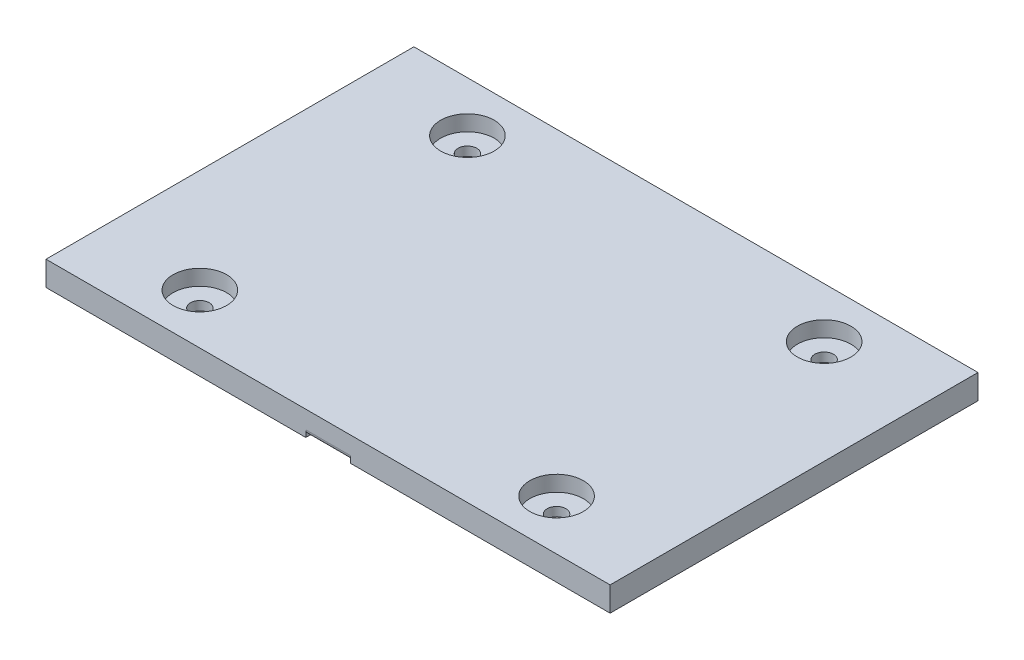
ISO-10303-21;
HEADER;
FILE_DESCRIPTION(('STEP AP214'),'2;1');
FILE_NAME('part.step','',(''),(''),'','','');
FILE_SCHEMA(('AUTOMOTIVE_DESIGN { 1 0 10303 214 1 1 1 1 }'));
ENDSEC;
DATA;
#1=APPLICATION_CONTEXT('core data for automotive mechanical design processes');
#2=APPLICATION_PROTOCOL_DEFINITION('international standard','automotive_design',2000,#1);
#3=PRODUCT_CONTEXT('',#1,'mechanical');
#4=PRODUCT('Part','Part','',(#3));
#5=PRODUCT_RELATED_PRODUCT_CATEGORY('part','',(#4));
#6=PRODUCT_DEFINITION_FORMATION('','',#4);
#7=PRODUCT_DEFINITION_CONTEXT('part definition',#1,'design');
#8=PRODUCT_DEFINITION('design','',#6,#7);
#9=PRODUCT_DEFINITION_SHAPE('','',#8);
#10=(LENGTH_UNIT() NAMED_UNIT(*) SI_UNIT(.MILLI.,.METRE.));
#11=(NAMED_UNIT(*) PLANE_ANGLE_UNIT() SI_UNIT($,.RADIAN.));
#12=(NAMED_UNIT(*) SI_UNIT($,.STERADIAN.) SOLID_ANGLE_UNIT());
#13=UNCERTAINTY_MEASURE_WITH_UNIT(LENGTH_MEASURE(1.E-05),#10,'distance_accuracy_value','');
#14=(GEOMETRIC_REPRESENTATION_CONTEXT(3) GLOBAL_UNCERTAINTY_ASSIGNED_CONTEXT((#13)) GLOBAL_UNIT_ASSIGNED_CONTEXT((#10,
#11,#12)) REPRESENTATION_CONTEXT('',''));
#15=CARTESIAN_POINT('',(0.,0.,0.));
#16=DIRECTION('',(0.,0.,1.));
#17=DIRECTION('',(1.,0.,0.));
#18=AXIS2_PLACEMENT_3D('',#15,#16,#17);
#19=CARTESIAN_POINT('',(0.,60.645974268059,0.));
#20=DIRECTION('',(0.,-1.,0.));
#21=DIRECTION('',(0.,0.,-1.));
#22=AXIS2_PLACEMENT_3D('',#19,#20,#21);
#23=PLANE('',#22);
#24=CARTESIAN_POINT('',(24.8089806938948,60.645974268059,119.523129836377));
#25=DIRECTION('',(0.,-1.,0.));
#26=DIRECTION('',(0.,0.,-1.));
#27=AXIS2_PLACEMENT_3D('',#24,#25,#26);
#28=CIRCLE('',#27,2.09999999999998);
#29=CARTESIAN_POINT('',(24.8089806938948,60.645974268059,117.423129836377));
#30=VERTEX_POINT('',#29);
#31=EDGE_CURVE('E389',#30,#30,#28,.T.);
#32=ORIENTED_EDGE('',*,*,#31,.T.);
#33=EDGE_LOOP('',(#32));
#34=FACE_BOUND('',#33,.T.);
#35=CARTESIAN_POINT('',(24.8089806938948,60.645974268059,119.523129836377));
#36=DIRECTION('',(0.,-1.,0.));
#37=DIRECTION('',(0.,0.,-1.));
#38=AXIS2_PLACEMENT_3D('',#35,#36,#37);
#39=CIRCLE('',#38,6.);
#40=CARTESIAN_POINT('',(24.8089806938948,60.645974268059,113.523129836377));
#41=VERTEX_POINT('',#40);
#42=EDGE_CURVE('E11',#41,#41,#39,.T.);
#43=ORIENTED_EDGE('',*,*,#42,.F.);
#44=EDGE_LOOP('',(#43));
#45=FACE_BOUND('',#44,.T.);
#46=ADVANCED_FACE('F32',(#34,#45),#23,.F.);
#47=CARTESIAN_POINT('',(104.808980693895,60.645974268059,119.523129836377));
#48=DIRECTION('',(0.,-1.,0.));
#49=DIRECTION('',(0.,0.,-1.));
#50=AXIS2_PLACEMENT_3D('',#47,#48,#49);
#51=CIRCLE('',#50,2.1);
#52=CARTESIAN_POINT('',(104.808980693895,60.645974268059,117.423129836377));
#53=VERTEX_POINT('',#52);
#54=EDGE_CURVE('E349',#53,#53,#51,.T.);
#55=ORIENTED_EDGE('',*,*,#54,.T.);
#56=EDGE_LOOP('',(#55));
#57=FACE_BOUND('',#56,.T.);
#58=CARTESIAN_POINT('',(104.808980693895,60.645974268059,119.523129836377));
#59=DIRECTION('',(0.,-1.,0.));
#60=DIRECTION('',(0.,0.,-1.));
#61=AXIS2_PLACEMENT_3D('',#58,#59,#60);
#62=CIRCLE('',#61,6.);
#63=CARTESIAN_POINT('',(104.808980693895,60.645974268059,113.523129836377));
#64=VERTEX_POINT('',#63);
#65=EDGE_CURVE('E41',#64,#64,#62,.T.);
#66=ORIENTED_EDGE('',*,*,#65,.F.);
#67=EDGE_LOOP('',(#66));
#68=FACE_BOUND('',#67,.T.);
#69=ADVANCED_FACE('F472',(#57,#68),#23,.F.);
#70=CARTESIAN_POINT('',(104.808980693895,60.645974268059,59.5231298363773));
#71=DIRECTION('',(0.,-1.,0.));
#72=DIRECTION('',(0.,0.,-1.));
#73=AXIS2_PLACEMENT_3D('',#70,#71,#72);
#74=CIRCLE('',#73,2.1);
#75=CARTESIAN_POINT('',(104.808980693895,60.645974268059,57.4231298363772));
#76=VERTEX_POINT('',#75);
#77=EDGE_CURVE('E395',#76,#76,#74,.T.);
#78=ORIENTED_EDGE('',*,*,#77,.T.);
#79=EDGE_LOOP('',(#78));
#80=FACE_BOUND('',#79,.T.);
#81=CARTESIAN_POINT('',(104.808980693895,60.645974268059,59.5231298363773));
#82=DIRECTION('',(0.,-1.,0.));
#83=DIRECTION('',(0.,0.,-1.));
#84=AXIS2_PLACEMENT_3D('',#81,#82,#83);
#85=CIRCLE('',#84,6.);
#86=CARTESIAN_POINT('',(104.808980693895,60.645974268059,53.5231298363773));
#87=VERTEX_POINT('',#86);
#88=EDGE_CURVE('E443',#87,#87,#85,.T.);
#89=ORIENTED_EDGE('',*,*,#88,.F.);
#90=EDGE_LOOP('',(#89));
#91=FACE_BOUND('',#90,.T.);
#92=ADVANCED_FACE('F479',(#80,#91),#23,.F.);
#93=CARTESIAN_POINT('',(24.8089806938948,60.645974268059,59.5231298363773));
#94=DIRECTION('',(0.,-1.,0.));
#95=DIRECTION('',(0.,0.,-1.));
#96=AXIS2_PLACEMENT_3D('',#93,#94,#95);
#97=CIRCLE('',#96,2.1);
#98=CARTESIAN_POINT('',(24.8089806938948,60.645974268059,57.4231298363773));
#99=VERTEX_POINT('',#98);
#100=EDGE_CURVE('E401',#99,#99,#97,.T.);
#101=ORIENTED_EDGE('',*,*,#100,.T.);
#102=EDGE_LOOP('',(#101));
#103=FACE_BOUND('',#102,.T.);
#104=CARTESIAN_POINT('',(24.8089806938948,60.645974268059,59.5231298363773));
#105=DIRECTION('',(0.,-1.,0.));
#106=DIRECTION('',(0.,0.,-1.));
#107=AXIS2_PLACEMENT_3D('',#104,#105,#106);
#108=CIRCLE('',#107,6.);
#109=CARTESIAN_POINT('',(24.8089806938948,60.645974268059,53.5231298363773));
#110=VERTEX_POINT('',#109);
#111=EDGE_CURVE('E241',#110,#110,#108,.T.);
#112=ORIENTED_EDGE('',*,*,#111,.F.);
#113=EDGE_LOOP('',(#112));
#114=FACE_BOUND('',#113,.T.);
#115=ADVANCED_FACE('F475',(#103,#114),#23,.F.);
#116=CARTESIAN_POINT('',(0.,58.6459742680589,0.));
#117=DIRECTION('',(0.,-1.,0.));
#118=DIRECTION('',(0.,0.,-1.));
#119=AXIS2_PLACEMENT_3D('',#116,#117,#118);
#120=PLANE('',#119);
#121=DIRECTION('',(0.,0.,1.));
#122=VECTOR('',#121,1.);
#123=CARTESIAN_POINT('',(69.8089806938948,58.6459742680589,0.));
#124=LINE('',#123,#122);
#125=CARTESIAN_POINT('',(69.8089806938948,58.6459742680589,121.523129836377));
#126=VERTEX_POINT('',#125);
#127=CARTESIAN_POINT('',(69.8089806938948,58.6459742680589,130.773129836377));
#128=VERTEX_POINT('',#127);
#129=EDGE_CURVE('E324',#126,#128,#124,.T.);
#130=ORIENTED_EDGE('',*,*,#129,.F.);
#131=DIRECTION('',(1.,0.,0.));
#132=VECTOR('',#131,1.);
#133=CARTESIAN_POINT('',(0.,58.6459742680589,121.523129836377));
#134=LINE('',#133,#132);
#135=CARTESIAN_POINT('',(96.8089806938948,58.6459742680589,121.523129836377));
#136=VERTEX_POINT('',#135);
#137=EDGE_CURVE('E321',#126,#136,#134,.T.);
#138=ORIENTED_EDGE('',*,*,#137,.T.);
#139=DIRECTION('',(0.,0.,-1.));
#140=VECTOR('',#139,1.);
#141=CARTESIAN_POINT('',(96.8089806938948,58.6459742680589,0.));
#142=LINE('',#141,#140);
#143=CARTESIAN_POINT('',(96.8089806938948,58.6459742680589,94.5231298363772));
#144=VERTEX_POINT('',#143);
#145=EDGE_CURVE('E318',#136,#144,#142,.T.);
#146=ORIENTED_EDGE('',*,*,#145,.T.);
#147=DIRECTION('',(-1.,0.,0.));
#148=VECTOR('',#147,1.);
#149=CARTESIAN_POINT('',(0.,58.6459742680589,94.5231298363772));
#150=LINE('',#149,#148);
#151=CARTESIAN_POINT('',(116.808980693895,58.6459742680589,94.5231298363772));
#152=VERTEX_POINT('',#151);
#153=EDGE_CURVE('E315',#152,#144,#150,.T.);
#154=ORIENTED_EDGE('',*,*,#153,.F.);
#155=DIRECTION('',(0.,0.,1.));
#156=VECTOR('',#155,1.);
#157=CARTESIAN_POINT('',(116.808980693895,58.6459742680589,0.));
#158=LINE('',#157,#156);
#159=CARTESIAN_POINT('',(116.808980693895,58.6459742680589,84.5231298363773));
#160=VERTEX_POINT('',#159);
#161=EDGE_CURVE('E312',#160,#152,#158,.T.);
#162=ORIENTED_EDGE('',*,*,#161,.F.);
#163=DIRECTION('',(1.,0.,0.));
#164=VECTOR('',#163,1.);
#165=CARTESIAN_POINT('',(0.,58.6459742680589,84.5231298363773));
#166=LINE('',#165,#164);
#167=CARTESIAN_POINT('',(96.8089806938948,58.6459742680589,84.5231298363773));
#168=VERTEX_POINT('',#167);
#169=EDGE_CURVE('E309',#168,#160,#166,.T.);
#170=ORIENTED_EDGE('',*,*,#169,.F.);
#171=DIRECTION('',(0.,0.,-1.));
#172=VECTOR('',#171,1.);
#173=CARTESIAN_POINT('',(96.8089806938948,58.6459742680589,0.));
#174=LINE('',#173,#172);
#175=CARTESIAN_POINT('',(96.8089806938948,58.6459742680589,57.5231298363773));
#176=VERTEX_POINT('',#175);
#177=EDGE_CURVE('E306',#168,#176,#174,.T.);
#178=ORIENTED_EDGE('',*,*,#177,.T.);
#179=DIRECTION('',(-1.,0.,0.));
#180=VECTOR('',#179,1.);
#181=CARTESIAN_POINT('',(0.,58.6459742680589,57.5231298363773));
#182=LINE('',#181,#180);
#183=CARTESIAN_POINT('',(69.8089806938948,58.6459742680589,57.5231298363773));
#184=VERTEX_POINT('',#183);
#185=EDGE_CURVE('E303',#176,#184,#182,.T.);
#186=ORIENTED_EDGE('',*,*,#185,.T.);
#187=DIRECTION('',(0.,0.,-1.));
#188=VECTOR('',#187,1.);
#189=CARTESIAN_POINT('',(69.8089806938948,58.6459742680589,0.));
#190=LINE('',#189,#188);
#191=CARTESIAN_POINT('',(69.8089806938948,58.6459742680589,48.2731298363773));
#192=VERTEX_POINT('',#191);
#193=EDGE_CURVE('E300',#184,#192,#190,.T.);
#194=ORIENTED_EDGE('',*,*,#193,.T.);
#195=DIRECTION('',(1.,0.,0.));
#196=VECTOR('',#195,1.);
#197=CARTESIAN_POINT('',(1.55898069389482,58.6459742680589,48.2731298363773));
#198=LINE('',#197,#196);
#199=CARTESIAN_POINT('',(128.058980693895,58.6459742680589,48.2731298363773));
#200=VERTEX_POINT('',#199);
#201=EDGE_CURVE('E407',#192,#200,#198,.T.);
#202=ORIENTED_EDGE('',*,*,#201,.T.);
#203=DIRECTION('',(0.,0.,1.));
#204=VECTOR('',#203,1.);
#205=CARTESIAN_POINT('',(128.058980693895,58.6459742680589,48.2731298363773));
#206=LINE('',#205,#204);
#207=CARTESIAN_POINT('',(128.058980693895,58.6459742680589,130.773129836377));
#208=VERTEX_POINT('',#207);
#209=EDGE_CURVE('E213',#200,#208,#206,.T.);
#210=ORIENTED_EDGE('',*,*,#209,.T.);
#211=DIRECTION('',(-1.,0.,0.));
#212=VECTOR('',#211,1.);
#213=CARTESIAN_POINT('',(128.058980693895,58.6459742680589,130.773129836377));
#214=LINE('',#213,#212);
#215=EDGE_CURVE('E415',#208,#128,#214,.T.);
#216=ORIENTED_EDGE('',*,*,#215,.T.);
#217=EDGE_LOOP('',(#130,#138,#146,#154,#162,#170,#178,#186,#194,#202,#210,#216));
#218=FACE_BOUND('',#217,.T.);
#219=CARTESIAN_POINT('',(104.808980693895,58.6459742680589,119.523129836377));
#220=DIRECTION('',(0.,-1.,0.));
#221=DIRECTION('',(0.,0.,-1.));
#222=AXIS2_PLACEMENT_3D('',#219,#220,#221);
#223=CIRCLE('',#222,2.1);
#224=CARTESIAN_POINT('',(104.808980693895,58.6459742680589,117.423129836377));
#225=VERTEX_POINT('',#224);
#226=EDGE_CURVE('E386',#225,#225,#223,.T.);
#227=ORIENTED_EDGE('',*,*,#226,.F.);
#228=EDGE_LOOP('',(#227));
#229=FACE_BOUND('',#228,.T.);
#230=CARTESIAN_POINT('',(104.808980693895,58.6459742680589,59.5231298363773));
#231=DIRECTION('',(0.,-1.,0.));
#232=DIRECTION('',(0.,0.,-1.));
#233=AXIS2_PLACEMENT_3D('',#230,#231,#232);
#234=CIRCLE('',#233,2.1);
#235=CARTESIAN_POINT('',(104.808980693895,58.6459742680589,57.4231298363772));
#236=VERTEX_POINT('',#235);
#237=EDGE_CURVE('E398',#236,#236,#234,.T.);
#238=ORIENTED_EDGE('',*,*,#237,.F.);
#239=EDGE_LOOP('',(#238));
#240=FACE_BOUND('',#239,.T.);
#241=ADVANCED_FACE('F484',(#218,#229,#240),#120,.T.);
#242=CARTESIAN_POINT('',(1.55898069389482,58.6459742680589,48.2731298363773));
#243=DIRECTION('',(0.,0.,1.));
#244=DIRECTION('',(1.,0.,0.));
#245=AXIS2_PLACEMENT_3D('',#242,#243,#244);
#246=PLANE('',#245);
#247=DIRECTION('',(-1.,0.,0.));
#248=VECTOR('',#247,1.);
#249=CARTESIAN_POINT('',(59.8089806938948,60.145974268059,48.2731298363773));
#250=LINE('',#249,#248);
#251=CARTESIAN_POINT('',(69.8089806938948,60.145974268059,48.2731298363773));
#252=VERTEX_POINT('',#251);
#253=CARTESIAN_POINT('',(59.8089806938948,60.145974268059,48.2731298363773));
#254=VERTEX_POINT('',#253);
#255=EDGE_CURVE('E217',#252,#254,#250,.T.);
#256=ORIENTED_EDGE('',*,*,#255,.T.);
#257=DIRECTION('',(0.,-1.,0.));
#258=VECTOR('',#257,1.);
#259=CARTESIAN_POINT('',(59.8089806938948,59.145974268059,48.2731298363773));
#260=LINE('',#259,#258);
#261=CARTESIAN_POINT('',(59.8089806938948,58.6459742680589,48.2731298363773));
#262=VERTEX_POINT('',#261);
#263=EDGE_CURVE('E382',#254,#262,#260,.T.);
#264=ORIENTED_EDGE('',*,*,#263,.T.);
#265=CARTESIAN_POINT('',(1.55898069389482,58.6459742680589,48.2731298363773));
#266=VERTEX_POINT('',#265);
#267=EDGE_CURVE('E410',#266,#262,#198,.T.);
#268=ORIENTED_EDGE('',*,*,#267,.F.);
#269=DIRECTION('',(0.,1.,0.));
#270=VECTOR('',#269,1.);
#271=CARTESIAN_POINT('',(1.55898069389482,58.6459742680589,48.2731298363773));
#272=LINE('',#271,#270);
#273=CARTESIAN_POINT('',(1.55898069389482,64.145974268059,48.2731298363773));
#274=VERTEX_POINT('',#273);
#275=EDGE_CURVE('E234',#266,#274,#272,.T.);
#276=ORIENTED_EDGE('',*,*,#275,.T.);
#277=DIRECTION('',(1.,0.,0.));
#278=VECTOR('',#277,1.);
#279=CARTESIAN_POINT('',(128.058980693895,64.145974268059,48.2731298363773));
#280=LINE('',#279,#278);
#281=CARTESIAN_POINT('',(128.058980693895,64.145974268059,48.2731298363773));
#282=VERTEX_POINT('',#281);
#283=EDGE_CURVE('E225',#274,#282,#280,.T.);
#284=ORIENTED_EDGE('',*,*,#283,.T.);
#285=DIRECTION('',(0.,1.,0.));
#286=VECTOR('',#285,1.);
#287=CARTESIAN_POINT('',(128.058980693895,58.6459742680589,48.2731298363773));
#288=LINE('',#287,#286);
#289=EDGE_CURVE('E208',#200,#282,#288,.T.);
#290=ORIENTED_EDGE('',*,*,#289,.F.);
#291=ORIENTED_EDGE('',*,*,#201,.F.);
#292=DIRECTION('',(0.,-1.,0.));
#293=VECTOR('',#292,1.);
#294=CARTESIAN_POINT('',(69.8089806938948,59.145974268059,48.2731298363773));
#295=LINE('',#294,#293);
#296=EDGE_CURVE('E380',#252,#192,#295,.T.);
#297=ORIENTED_EDGE('',*,*,#296,.F.);
#298=EDGE_LOOP('',(#256,#264,#268,#276,#284,#290,#291,#297));
#299=FACE_BOUND('',#298,.T.);
#300=ADVANCED_FACE('F231',(#299),#246,.F.);
#301=DIRECTION('',(0.,0.,-1.));
#302=VECTOR('',#301,1.);
#303=CARTESIAN_POINT('',(59.8089806938948,58.6459742680589,0.));
#304=LINE('',#303,#302);
#305=CARTESIAN_POINT('',(59.8089806938948,58.6459742680589,130.773129836377));
#306=VERTEX_POINT('',#305);
#307=CARTESIAN_POINT('',(59.8089806938948,58.6459742680589,121.523129836377));
#308=VERTEX_POINT('',#307);
#309=EDGE_CURVE('E326',#306,#308,#304,.T.);
#310=ORIENTED_EDGE('',*,*,#309,.F.);
#311=CARTESIAN_POINT('',(1.55898069389482,58.6459742680589,130.773129836377));
#312=VERTEX_POINT('',#311);
#313=EDGE_CURVE('E414',#306,#312,#214,.T.);
#314=ORIENTED_EDGE('',*,*,#313,.T.);
#315=DIRECTION('',(0.,0.,-1.));
#316=VECTOR('',#315,1.);
#317=CARTESIAN_POINT('',(1.55898069389482,58.6459742680589,130.773129836377));
#318=LINE('',#317,#316);
#319=EDGE_CURVE('E418',#312,#266,#318,.T.);
#320=ORIENTED_EDGE('',*,*,#319,.T.);
#321=ORIENTED_EDGE('',*,*,#267,.T.);
#322=DIRECTION('',(0.,0.,-1.));
#323=VECTOR('',#322,1.);
#324=CARTESIAN_POINT('',(59.8089806938948,58.6459742680589,0.));
#325=LINE('',#324,#323);
#326=CARTESIAN_POINT('',(59.8089806938948,58.6459742680589,57.5231298363773));
#327=VERTEX_POINT('',#326);
#328=EDGE_CURVE('E298',#327,#262,#325,.T.);
#329=ORIENTED_EDGE('',*,*,#328,.F.);
#330=DIRECTION('',(-1.,0.,0.));
#331=VECTOR('',#330,1.);
#332=CARTESIAN_POINT('',(0.,58.6459742680589,57.5231298363773));
#333=LINE('',#332,#331);
#334=CARTESIAN_POINT('',(32.8089806938948,58.6459742680589,57.5231298363773));
#335=VERTEX_POINT('',#334);
#336=EDGE_CURVE('E246',#327,#335,#333,.T.);
#337=ORIENTED_EDGE('',*,*,#336,.T.);
#338=DIRECTION('',(0.,0.,1.));
#339=VECTOR('',#338,1.);
#340=CARTESIAN_POINT('',(32.8089806938948,58.6459742680589,0.));
#341=LINE('',#340,#339);
#342=CARTESIAN_POINT('',(32.8089806938948,58.6459742680589,84.5231298363773));
#343=VERTEX_POINT('',#342);
#344=EDGE_CURVE('E251',#335,#343,#341,.T.);
#345=ORIENTED_EDGE('',*,*,#344,.T.);
#346=DIRECTION('',(1.,0.,0.));
#347=VECTOR('',#346,1.);
#348=CARTESIAN_POINT('',(0.,58.6459742680589,84.5231298363773));
#349=LINE('',#348,#347);
#350=CARTESIAN_POINT('',(12.8089806938948,58.6459742680589,84.5231298363773));
#351=VERTEX_POINT('',#350);
#352=EDGE_CURVE('E341',#351,#343,#349,.T.);
#353=ORIENTED_EDGE('',*,*,#352,.F.);
#354=DIRECTION('',(0.,0.,-1.));
#355=VECTOR('',#354,1.);
#356=CARTESIAN_POINT('',(12.8089806938948,58.6459742680589,0.));
#357=LINE('',#356,#355);
#358=CARTESIAN_POINT('',(12.8089806938948,58.6459742680589,94.5231298363772));
#359=VERTEX_POINT('',#358);
#360=EDGE_CURVE('E338',#359,#351,#357,.T.);
#361=ORIENTED_EDGE('',*,*,#360,.F.);
#362=DIRECTION('',(-1.,0.,0.));
#363=VECTOR('',#362,1.);
#364=CARTESIAN_POINT('',(0.,58.6459742680589,94.5231298363772));
#365=LINE('',#364,#363);
#366=CARTESIAN_POINT('',(32.8089806938948,58.6459742680589,94.5231298363772));
#367=VERTEX_POINT('',#366);
#368=EDGE_CURVE('E335',#367,#359,#365,.T.);
#369=ORIENTED_EDGE('',*,*,#368,.F.);
#370=DIRECTION('',(0.,0.,1.));
#371=VECTOR('',#370,1.);
#372=CARTESIAN_POINT('',(32.8089806938948,58.6459742680589,0.));
#373=LINE('',#372,#371);
#374=CARTESIAN_POINT('',(32.8089806938948,58.6459742680589,121.523129836377));
#375=VERTEX_POINT('',#374);
#376=EDGE_CURVE('E332',#367,#375,#373,.T.);
#377=ORIENTED_EDGE('',*,*,#376,.T.);
#378=DIRECTION('',(1.,0.,0.));
#379=VECTOR('',#378,1.);
#380=CARTESIAN_POINT('',(0.,58.6459742680589,121.523129836377));
#381=LINE('',#380,#379);
#382=EDGE_CURVE('E329',#375,#308,#381,.T.);
#383=ORIENTED_EDGE('',*,*,#382,.T.);
#384=EDGE_LOOP('',(#310,#314,#320,#321,#329,#337,#345,#353,#361,#369,#377,#383));
#385=FACE_BOUND('',#384,.T.);
#386=CARTESIAN_POINT('',(24.8089806938948,58.6459742680589,119.523129836377));
#387=DIRECTION('',(0.,-1.,0.));
#388=DIRECTION('',(0.,0.,-1.));
#389=AXIS2_PLACEMENT_3D('',#386,#387,#388);
#390=CIRCLE('',#389,2.09999999999998);
#391=CARTESIAN_POINT('',(24.8089806938948,58.6459742680589,117.423129836377));
#392=VERTEX_POINT('',#391);
#393=EDGE_CURVE('E392',#392,#392,#390,.T.);
#394=ORIENTED_EDGE('',*,*,#393,.F.);
#395=EDGE_LOOP('',(#394));
#396=FACE_BOUND('',#395,.T.);
#397=CARTESIAN_POINT('',(24.8089806938948,58.6459742680589,59.5231298363773));
#398=DIRECTION('',(0.,-1.,0.));
#399=DIRECTION('',(0.,0.,-1.));
#400=AXIS2_PLACEMENT_3D('',#397,#398,#399);
#401=CIRCLE('',#400,2.1);
#402=CARTESIAN_POINT('',(24.8089806938948,58.6459742680589,57.4231298363773));
#403=VERTEX_POINT('',#402);
#404=EDGE_CURVE('E404',#403,#403,#401,.T.);
#405=ORIENTED_EDGE('',*,*,#404,.F.);
#406=EDGE_LOOP('',(#405));
#407=FACE_BOUND('',#406,.T.);
#408=ADVANCED_FACE('F491',(#385,#396,#407),#120,.T.);
#409=CARTESIAN_POINT('',(128.058980693895,58.6459742680589,48.2731298363773));
#410=DIRECTION('',(-1.,0.,0.));
#411=DIRECTION('',(0.,0.,1.));
#412=AXIS2_PLACEMENT_3D('',#409,#410,#411);
#413=PLANE('',#412);
#414=ORIENTED_EDGE('',*,*,#289,.T.);
#415=DIRECTION('',(0.,0.,1.));
#416=VECTOR('',#415,1.);
#417=CARTESIAN_POINT('',(128.058980693895,64.145974268059,130.773129836377));
#418=LINE('',#417,#416);
#419=CARTESIAN_POINT('',(128.058980693895,64.145974268059,130.773129836377));
#420=VERTEX_POINT('',#419);
#421=EDGE_CURVE('E212',#282,#420,#418,.T.);
#422=ORIENTED_EDGE('',*,*,#421,.T.);
#423=DIRECTION('',(0.,1.,0.));
#424=VECTOR('',#423,1.);
#425=CARTESIAN_POINT('',(128.058980693895,58.6459742680589,130.773129836377));
#426=LINE('',#425,#424);
#427=EDGE_CURVE('E218',#208,#420,#426,.T.);
#428=ORIENTED_EDGE('',*,*,#427,.F.);
#429=ORIENTED_EDGE('',*,*,#209,.F.);
#430=EDGE_LOOP('',(#414,#422,#428,#429));
#431=FACE_BOUND('',#430,.T.);
#432=ADVANCED_FACE('F210',(#431),#413,.F.);
#433=CARTESIAN_POINT('',(128.058980693895,58.6459742680589,130.773129836377));
#434=DIRECTION('',(0.,0.,-1.));
#435=DIRECTION('',(-1.,0.,0.));
#436=AXIS2_PLACEMENT_3D('',#433,#434,#435);
#437=PLANE('',#436);
#438=DIRECTION('',(0.,-1.,0.));
#439=VECTOR('',#438,1.);
#440=CARTESIAN_POINT('',(59.8089806938948,59.145974268059,130.773129836377));
#441=LINE('',#440,#439);
#442=CARTESIAN_POINT('',(59.8089806938948,60.145974268059,130.773129836377));
#443=VERTEX_POINT('',#442);
#444=EDGE_CURVE('E49',#443,#306,#441,.T.);
#445=ORIENTED_EDGE('',*,*,#444,.F.);
#446=DIRECTION('',(-1.,0.,0.));
#447=VECTOR('',#446,1.);
#448=CARTESIAN_POINT('',(69.8089806938948,60.145974268059,130.773129836377));
#449=LINE('',#448,#447);
#450=CARTESIAN_POINT('',(69.8089806938948,60.145974268059,130.773129836377));
#451=VERTEX_POINT('',#450);
#452=EDGE_CURVE('E430',#443,#451,#449,.F.);
#453=ORIENTED_EDGE('',*,*,#452,.T.);
#454=DIRECTION('',(0.,-1.,0.));
#455=VECTOR('',#454,1.);
#456=CARTESIAN_POINT('',(69.8089806938948,59.145974268059,130.773129836377));
#457=LINE('',#456,#455);
#458=EDGE_CURVE('E57',#451,#128,#457,.T.);
#459=ORIENTED_EDGE('',*,*,#458,.T.);
#460=ORIENTED_EDGE('',*,*,#215,.F.);
#461=ORIENTED_EDGE('',*,*,#427,.T.);
#462=DIRECTION('',(-1.,0.,0.));
#463=VECTOR('',#462,1.);
#464=CARTESIAN_POINT('',(1.55898069389482,64.145974268059,130.773129836377));
#465=LINE('',#464,#463);
#466=CARTESIAN_POINT('',(1.55898069389482,64.145974268059,130.773129836377));
#467=VERTEX_POINT('',#466);
#468=EDGE_CURVE('E228',#420,#467,#465,.T.);
#469=ORIENTED_EDGE('',*,*,#468,.T.);
#470=DIRECTION('',(0.,1.,0.));
#471=VECTOR('',#470,1.);
#472=CARTESIAN_POINT('',(1.55898069389482,58.6459742680589,130.773129836377));
#473=LINE('',#472,#471);
#474=EDGE_CURVE('E421',#312,#467,#473,.T.);
#475=ORIENTED_EDGE('',*,*,#474,.F.);
#476=ORIENTED_EDGE('',*,*,#313,.F.);
#477=EDGE_LOOP('',(#445,#453,#459,#460,#461,#469,#475,#476));
#478=FACE_BOUND('',#477,.T.);
#479=ADVANCED_FACE('F509',(#478),#437,.F.);
#480=CARTESIAN_POINT('',(1.55898069389482,58.6459742680589,130.773129836377));
#481=DIRECTION('',(1.,0.,0.));
#482=DIRECTION('',(0.,0.,-1.));
#483=AXIS2_PLACEMENT_3D('',#480,#481,#482);
#484=PLANE('',#483);
#485=ORIENTED_EDGE('',*,*,#474,.T.);
#486=DIRECTION('',(0.,0.,-1.));
#487=VECTOR('',#486,1.);
#488=CARTESIAN_POINT('',(1.55898069389482,64.145974268059,48.2731298363773));
#489=LINE('',#488,#487);
#490=EDGE_CURVE('E244',#467,#274,#489,.T.);
#491=ORIENTED_EDGE('',*,*,#490,.T.);
#492=ORIENTED_EDGE('',*,*,#275,.F.);
#493=ORIENTED_EDGE('',*,*,#319,.F.);
#494=EDGE_LOOP('',(#485,#491,#492,#493));
#495=FACE_BOUND('',#494,.T.);
#496=ADVANCED_FACE('F499',(#495),#484,.F.);
#497=CARTESIAN_POINT('',(24.8089806938948,58.6459742680589,59.5231298363773));
#498=DIRECTION('',(0.,1.,0.));
#499=DIRECTION('',(0.,0.,1.));
#500=AXIS2_PLACEMENT_3D('',#497,#498,#499);
#501=CYLINDRICAL_SURFACE('',#500,2.1);
#502=ORIENTED_EDGE('',*,*,#404,.T.);
#503=EDGE_LOOP('',(#502));
#504=FACE_BOUND('',#503,.T.);
#505=ORIENTED_EDGE('',*,*,#100,.F.);
#506=EDGE_LOOP('',(#505));
#507=FACE_BOUND('',#506,.T.);
#508=ADVANCED_FACE('F496',(#504,#507),#501,.F.);
#509=CARTESIAN_POINT('',(104.808980693895,58.6459742680589,59.5231298363773));
#510=DIRECTION('',(0.,1.,0.));
#511=DIRECTION('',(0.,0.,1.));
#512=AXIS2_PLACEMENT_3D('',#509,#510,#511);
#513=CYLINDRICAL_SURFACE('',#512,2.1);
#514=ORIENTED_EDGE('',*,*,#237,.T.);
#515=EDGE_LOOP('',(#514));
#516=FACE_BOUND('',#515,.T.);
#517=ORIENTED_EDGE('',*,*,#77,.F.);
#518=EDGE_LOOP('',(#517));
#519=FACE_BOUND('',#518,.T.);
#520=ADVANCED_FACE('F498',(#516,#519),#513,.F.);
#521=CARTESIAN_POINT('',(24.8089806938948,58.6459742680589,119.523129836377));
#522=DIRECTION('',(0.,1.,0.));
#523=DIRECTION('',(0.,0.,1.));
#524=AXIS2_PLACEMENT_3D('',#521,#522,#523);
#525=CYLINDRICAL_SURFACE('',#524,2.09999999999998);
#526=ORIENTED_EDGE('',*,*,#393,.T.);
#527=EDGE_LOOP('',(#526));
#528=FACE_BOUND('',#527,.T.);
#529=ORIENTED_EDGE('',*,*,#31,.F.);
#530=EDGE_LOOP('',(#529));
#531=FACE_BOUND('',#530,.T.);
#532=ADVANCED_FACE('F506',(#528,#531),#525,.F.);
#533=CARTESIAN_POINT('',(104.808980693895,58.6459742680589,119.523129836377));
#534=DIRECTION('',(0.,1.,0.));
#535=DIRECTION('',(0.,0.,1.));
#536=AXIS2_PLACEMENT_3D('',#533,#534,#535);
#537=CYLINDRICAL_SURFACE('',#536,2.1);
#538=ORIENTED_EDGE('',*,*,#226,.T.);
#539=EDGE_LOOP('',(#538));
#540=FACE_BOUND('',#539,.T.);
#541=ORIENTED_EDGE('',*,*,#54,.F.);
#542=EDGE_LOOP('',(#541));
#543=FACE_BOUND('',#542,.T.);
#544=ADVANCED_FACE('F528',(#540,#543),#537,.F.);
#545=CARTESIAN_POINT('',(0.,59.145974268059,57.5231298363773));
#546=DIRECTION('',(0.,0.,1.));
#547=DIRECTION('',(1.,0.,0.));
#548=AXIS2_PLACEMENT_3D('',#545,#546,#547);
#549=PLANE('',#548);
#550=ORIENTED_EDGE('',*,*,#336,.F.);
#551=DIRECTION('',(0.,-1.,0.));
#552=VECTOR('',#551,1.);
#553=CARTESIAN_POINT('',(59.8089806938948,59.145974268059,57.5231298363773));
#554=LINE('',#553,#552);
#555=CARTESIAN_POINT('',(59.8089806938948,59.145974268059,57.5231298363773));
#556=VERTEX_POINT('',#555);
#557=EDGE_CURVE('E295',#556,#327,#554,.T.);
#558=ORIENTED_EDGE('',*,*,#557,.F.);
#559=DIRECTION('',(-1.,0.,0.));
#560=VECTOR('',#559,1.);
#561=CARTESIAN_POINT('',(0.,59.145974268059,57.5231298363773));
#562=LINE('',#561,#560);
#563=CARTESIAN_POINT('',(32.8089806938948,59.145974268059,57.5231298363773));
#564=VERTEX_POINT('',#563);
#565=EDGE_CURVE('E247',#556,#564,#562,.T.);
#566=ORIENTED_EDGE('',*,*,#565,.T.);
#567=DIRECTION('',(0.,-1.,0.));
#568=VECTOR('',#567,1.);
#569=CARTESIAN_POINT('',(32.8089806938948,59.145974268059,57.5231298363773));
#570=LINE('',#569,#568);
#571=EDGE_CURVE('E346',#564,#335,#570,.T.);
#572=ORIENTED_EDGE('',*,*,#571,.T.);
#573=EDGE_LOOP('',(#550,#558,#566,#572));
#574=FACE_BOUND('',#573,.T.);
#575=ADVANCED_FACE('F533',(#574),#549,.T.);
#576=CARTESIAN_POINT('',(32.8089806938948,59.145974268059,0.));
#577=DIRECTION('',(1.,0.,0.));
#578=DIRECTION('',(0.,0.,-1.));
#579=AXIS2_PLACEMENT_3D('',#576,#577,#578);
#580=PLANE('',#579);
#581=ORIENTED_EDGE('',*,*,#344,.F.);
#582=ORIENTED_EDGE('',*,*,#571,.F.);
#583=DIRECTION('',(0.,0.,1.));
#584=VECTOR('',#583,1.);
#585=CARTESIAN_POINT('',(32.8089806938948,59.145974268059,0.));
#586=LINE('',#585,#584);
#587=CARTESIAN_POINT('',(32.8089806938948,59.145974268059,84.5231298363773));
#588=VERTEX_POINT('',#587);
#589=EDGE_CURVE('E293',#564,#588,#586,.T.);
#590=ORIENTED_EDGE('',*,*,#589,.T.);
#591=DIRECTION('',(0.,-1.,0.));
#592=VECTOR('',#591,1.);
#593=CARTESIAN_POINT('',(32.8089806938948,59.145974268059,84.5231298363773));
#594=LINE('',#593,#592);
#595=EDGE_CURVE('E350',#588,#343,#594,.T.);
#596=ORIENTED_EDGE('',*,*,#595,.T.);
#597=EDGE_LOOP('',(#581,#582,#590,#596));
#598=FACE_BOUND('',#597,.T.);
#599=ADVANCED_FACE('F539',(#598),#580,.T.);
#600=CARTESIAN_POINT('',(0.,59.145974268059,84.5231298363773));
#601=DIRECTION('',(0.,0.,-1.));
#602=DIRECTION('',(-1.,0.,0.));
#603=AXIS2_PLACEMENT_3D('',#600,#601,#602);
#604=PLANE('',#603);
#605=ORIENTED_EDGE('',*,*,#352,.T.);
#606=ORIENTED_EDGE('',*,*,#595,.F.);
#607=DIRECTION('',(1.,0.,0.));
#608=VECTOR('',#607,1.);
#609=CARTESIAN_POINT('',(0.,59.145974268059,84.5231298363773));
#610=LINE('',#609,#608);
#611=CARTESIAN_POINT('',(12.8089806938948,59.145974268059,84.5231298363773));
#612=VERTEX_POINT('',#611);
#613=EDGE_CURVE('E290',#612,#588,#610,.T.);
#614=ORIENTED_EDGE('',*,*,#613,.F.);
#615=DIRECTION('',(0.,-1.,0.));
#616=VECTOR('',#615,1.);
#617=CARTESIAN_POINT('',(12.8089806938948,59.145974268059,84.5231298363773));
#618=LINE('',#617,#616);
#619=EDGE_CURVE('E352',#612,#351,#618,.T.);
#620=ORIENTED_EDGE('',*,*,#619,.T.);
#621=EDGE_LOOP('',(#605,#606,#614,#620));
#622=FACE_BOUND('',#621,.T.);
#623=ADVANCED_FACE('F599',(#622),#604,.F.);
#624=CARTESIAN_POINT('',(12.8089806938948,59.145974268059,0.));
#625=DIRECTION('',(-1.,0.,0.));
#626=DIRECTION('',(0.,0.,1.));
#627=AXIS2_PLACEMENT_3D('',#624,#625,#626);
#628=PLANE('',#627);
#629=ORIENTED_EDGE('',*,*,#360,.T.);
#630=ORIENTED_EDGE('',*,*,#619,.F.);
#631=DIRECTION('',(0.,0.,-1.));
#632=VECTOR('',#631,1.);
#633=CARTESIAN_POINT('',(12.8089806938948,59.145974268059,0.));
#634=LINE('',#633,#632);
#635=CARTESIAN_POINT('',(12.8089806938948,59.145974268059,94.5231298363772));
#636=VERTEX_POINT('',#635);
#637=EDGE_CURVE('E287',#636,#612,#634,.T.);
#638=ORIENTED_EDGE('',*,*,#637,.F.);
#639=DIRECTION('',(0.,-1.,0.));
#640=VECTOR('',#639,1.);
#641=CARTESIAN_POINT('',(12.8089806938948,59.145974268059,94.5231298363772));
#642=LINE('',#641,#640);
#643=EDGE_CURVE('E354',#636,#359,#642,.T.);
#644=ORIENTED_EDGE('',*,*,#643,.T.);
#645=EDGE_LOOP('',(#629,#630,#638,#644));
#646=FACE_BOUND('',#645,.T.);
#647=ADVANCED_FACE('F595',(#646),#628,.F.);
#648=CARTESIAN_POINT('',(0.,59.145974268059,94.5231298363772));
#649=DIRECTION('',(0.,0.,1.));
#650=DIRECTION('',(1.,0.,0.));
#651=AXIS2_PLACEMENT_3D('',#648,#649,#650);
#652=PLANE('',#651);
#653=ORIENTED_EDGE('',*,*,#368,.T.);
#654=ORIENTED_EDGE('',*,*,#643,.F.);
#655=DIRECTION('',(-1.,0.,0.));
#656=VECTOR('',#655,1.);
#657=CARTESIAN_POINT('',(0.,59.145974268059,94.5231298363772));
#658=LINE('',#657,#656);
#659=CARTESIAN_POINT('',(32.8089806938948,59.145974268059,94.5231298363772));
#660=VERTEX_POINT('',#659);
#661=EDGE_CURVE('E284',#660,#636,#658,.T.);
#662=ORIENTED_EDGE('',*,*,#661,.F.);
#663=DIRECTION('',(0.,-1.,0.));
#664=VECTOR('',#663,1.);
#665=CARTESIAN_POINT('',(32.8089806938948,59.145974268059,94.5231298363772));
#666=LINE('',#665,#664);
#667=EDGE_CURVE('E356',#660,#367,#666,.T.);
#668=ORIENTED_EDGE('',*,*,#667,.T.);
#669=EDGE_LOOP('',(#653,#654,#662,#668));
#670=FACE_BOUND('',#669,.T.);
#671=ADVANCED_FACE('F591',(#670),#652,.F.);
#672=CARTESIAN_POINT('',(32.8089806938948,59.145974268059,0.));
#673=DIRECTION('',(1.,0.,0.));
#674=DIRECTION('',(0.,0.,-1.));
#675=AXIS2_PLACEMENT_3D('',#672,#673,#674);
#676=PLANE('',#675);
#677=ORIENTED_EDGE('',*,*,#376,.F.);
#678=ORIENTED_EDGE('',*,*,#667,.F.);
#679=DIRECTION('',(0.,0.,1.));
#680=VECTOR('',#679,1.);
#681=CARTESIAN_POINT('',(32.8089806938948,59.145974268059,0.));
#682=LINE('',#681,#680);
#683=CARTESIAN_POINT('',(32.8089806938948,59.145974268059,121.523129836377));
#684=VERTEX_POINT('',#683);
#685=EDGE_CURVE('E282',#660,#684,#682,.T.);
#686=ORIENTED_EDGE('',*,*,#685,.T.);
#687=DIRECTION('',(0.,-1.,0.));
#688=VECTOR('',#687,1.);
#689=CARTESIAN_POINT('',(32.8089806938948,59.145974268059,121.523129836377));
#690=LINE('',#689,#688);
#691=EDGE_CURVE('E358',#684,#375,#690,.T.);
#692=ORIENTED_EDGE('',*,*,#691,.T.);
#693=EDGE_LOOP('',(#677,#678,#686,#692));
#694=FACE_BOUND('',#693,.T.);
#695=ADVANCED_FACE('F587',(#694),#676,.T.);
#696=CARTESIAN_POINT('',(0.,59.145974268059,121.523129836377));
#697=DIRECTION('',(0.,0.,-1.));
#698=DIRECTION('',(-1.,0.,0.));
#699=AXIS2_PLACEMENT_3D('',#696,#697,#698);
#700=PLANE('',#699);
#701=ORIENTED_EDGE('',*,*,#382,.F.);
#702=ORIENTED_EDGE('',*,*,#691,.F.);
#703=DIRECTION('',(1.,0.,0.));
#704=VECTOR('',#703,1.);
#705=CARTESIAN_POINT('',(0.,59.145974268059,121.523129836377));
#706=LINE('',#705,#704);
#707=CARTESIAN_POINT('',(59.8089806938948,59.145974268059,121.523129836377));
#708=VERTEX_POINT('',#707);
#709=EDGE_CURVE('E279',#684,#708,#706,.T.);
#710=ORIENTED_EDGE('',*,*,#709,.T.);
#711=DIRECTION('',(0.,-1.,0.));
#712=VECTOR('',#711,1.);
#713=CARTESIAN_POINT('',(59.8089806938948,59.145974268059,121.523129836377));
#714=LINE('',#713,#712);
#715=EDGE_CURVE('E360',#708,#308,#714,.T.);
#716=ORIENTED_EDGE('',*,*,#715,.T.);
#717=EDGE_LOOP('',(#701,#702,#710,#716));
#718=FACE_BOUND('',#717,.T.);
#719=ADVANCED_FACE('F584',(#718),#700,.T.);
#720=CARTESIAN_POINT('',(59.8089806938948,59.145974268059,0.));
#721=DIRECTION('',(-1.,0.,0.));
#722=DIRECTION('',(0.,0.,1.));
#723=AXIS2_PLACEMENT_3D('',#720,#721,#722);
#724=PLANE('',#723);
#725=ORIENTED_EDGE('',*,*,#309,.T.);
#726=ORIENTED_EDGE('',*,*,#715,.F.);
#727=DIRECTION('',(0.,0.,-1.));
#728=VECTOR('',#727,1.);
#729=CARTESIAN_POINT('',(59.8089806938948,59.145974268059,0.));
#730=LINE('',#729,#728);
#731=CARTESIAN_POINT('',(59.8089806938948,59.145974268059,129.773129836377));
#732=VERTEX_POINT('',#731);
#733=EDGE_CURVE('E277',#732,#708,#730,.T.);
#734=ORIENTED_EDGE('',*,*,#733,.F.);
#735=CARTESIAN_POINT('',(59.8089806938948,60.145974268059,129.773129836377));
#736=DIRECTION('',(-1.,0.,0.));
#737=DIRECTION('',(0.,0.,1.));
#738=AXIS2_PLACEMENT_3D('',#735,#736,#737);
#739=CIRCLE('',#738,1.);
#740=EDGE_CURVE('E436',#732,#443,#739,.T.);
#741=ORIENTED_EDGE('',*,*,#740,.T.);
#742=ORIENTED_EDGE('',*,*,#444,.T.);
#743=EDGE_LOOP('',(#725,#726,#734,#741,#742));
#744=FACE_BOUND('',#743,.T.);
#745=ADVANCED_FACE('F581',(#744),#724,.F.);
#746=CARTESIAN_POINT('',(69.8089806938948,59.145974268059,0.));
#747=DIRECTION('',(1.,0.,0.));
#748=DIRECTION('',(0.,0.,-1.));
#749=AXIS2_PLACEMENT_3D('',#746,#747,#748);
#750=PLANE('',#749);
#751=ORIENTED_EDGE('',*,*,#129,.T.);
#752=ORIENTED_EDGE('',*,*,#458,.F.);
#753=CARTESIAN_POINT('',(69.8089806938948,60.145974268059,129.773129836377));
#754=DIRECTION('',(1.,0.,0.));
#755=DIRECTION('',(0.,0.,-1.));
#756=AXIS2_PLACEMENT_3D('',#753,#754,#755);
#757=CIRCLE('',#756,1.);
#758=CARTESIAN_POINT('',(69.8089806938948,59.145974268059,129.773129836377));
#759=VERTEX_POINT('',#758);
#760=EDGE_CURVE('E36',#451,#759,#757,.T.);
#761=ORIENTED_EDGE('',*,*,#760,.T.);
#762=DIRECTION('',(0.,0.,1.));
#763=VECTOR('',#762,1.);
#764=CARTESIAN_POINT('',(69.8089806938948,59.145974268059,0.));
#765=LINE('',#764,#763);
#766=CARTESIAN_POINT('',(69.8089806938948,59.145974268059,121.523129836377));
#767=VERTEX_POINT('',#766);
#768=EDGE_CURVE('E274',#767,#759,#765,.T.);
#769=ORIENTED_EDGE('',*,*,#768,.F.);
#770=DIRECTION('',(0.,-1.,0.));
#771=VECTOR('',#770,1.);
#772=CARTESIAN_POINT('',(69.8089806938948,59.145974268059,121.523129836377));
#773=LINE('',#772,#771);
#774=EDGE_CURVE('E364',#767,#126,#773,.T.);
#775=ORIENTED_EDGE('',*,*,#774,.T.);
#776=EDGE_LOOP('',(#751,#752,#761,#769,#775));
#777=FACE_BOUND('',#776,.T.);
#778=ADVANCED_FACE('F577',(#777),#750,.F.);
#779=CARTESIAN_POINT('',(0.,59.145974268059,121.523129836377));
#780=DIRECTION('',(0.,0.,-1.));
#781=DIRECTION('',(-1.,0.,0.));
#782=AXIS2_PLACEMENT_3D('',#779,#780,#781);
#783=PLANE('',#782);
#784=ORIENTED_EDGE('',*,*,#137,.F.);
#785=ORIENTED_EDGE('',*,*,#774,.F.);
#786=DIRECTION('',(1.,0.,0.));
#787=VECTOR('',#786,1.);
#788=CARTESIAN_POINT('',(0.,59.145974268059,121.523129836377));
#789=LINE('',#788,#787);
#790=CARTESIAN_POINT('',(96.8089806938948,59.145974268059,121.523129836377));
#791=VERTEX_POINT('',#790);
#792=EDGE_CURVE('E272',#767,#791,#789,.T.);
#793=ORIENTED_EDGE('',*,*,#792,.T.);
#794=DIRECTION('',(0.,-1.,0.));
#795=VECTOR('',#794,1.);
#796=CARTESIAN_POINT('',(96.8089806938948,59.145974268059,121.523129836377));
#797=LINE('',#796,#795);
#798=EDGE_CURVE('E366',#791,#136,#797,.T.);
#799=ORIENTED_EDGE('',*,*,#798,.T.);
#800=EDGE_LOOP('',(#784,#785,#793,#799));
#801=FACE_BOUND('',#800,.T.);
#802=ADVANCED_FACE('F573',(#801),#783,.T.);
#803=CARTESIAN_POINT('',(96.8089806938948,59.145974268059,0.));
#804=DIRECTION('',(-1.,0.,0.));
#805=DIRECTION('',(0.,0.,1.));
#806=AXIS2_PLACEMENT_3D('',#803,#804,#805);
#807=PLANE('',#806);
#808=ORIENTED_EDGE('',*,*,#145,.F.);
#809=ORIENTED_EDGE('',*,*,#798,.F.);
#810=DIRECTION('',(0.,0.,-1.));
#811=VECTOR('',#810,1.);
#812=CARTESIAN_POINT('',(96.8089806938948,59.145974268059,0.));
#813=LINE('',#812,#811);
#814=CARTESIAN_POINT('',(96.8089806938948,59.145974268059,94.5231298363772));
#815=VERTEX_POINT('',#814);
#816=EDGE_CURVE('E270',#791,#815,#813,.T.);
#817=ORIENTED_EDGE('',*,*,#816,.T.);
#818=DIRECTION('',(0.,-1.,0.));
#819=VECTOR('',#818,1.);
#820=CARTESIAN_POINT('',(96.8089806938948,59.145974268059,94.5231298363772));
#821=LINE('',#820,#819);
#822=EDGE_CURVE('E368',#815,#144,#821,.T.);
#823=ORIENTED_EDGE('',*,*,#822,.T.);
#824=EDGE_LOOP('',(#808,#809,#817,#823));
#825=FACE_BOUND('',#824,.T.);
#826=ADVANCED_FACE('F569',(#825),#807,.T.);
#827=CARTESIAN_POINT('',(0.,59.145974268059,94.5231298363772));
#828=DIRECTION('',(0.,0.,1.));
#829=DIRECTION('',(1.,0.,0.));
#830=AXIS2_PLACEMENT_3D('',#827,#828,#829);
#831=PLANE('',#830);
#832=ORIENTED_EDGE('',*,*,#153,.T.);
#833=ORIENTED_EDGE('',*,*,#822,.F.);
#834=DIRECTION('',(-1.,0.,0.));
#835=VECTOR('',#834,1.);
#836=CARTESIAN_POINT('',(0.,59.145974268059,94.5231298363772));
#837=LINE('',#836,#835);
#838=CARTESIAN_POINT('',(116.808980693895,59.145974268059,94.5231298363772));
#839=VERTEX_POINT('',#838);
#840=EDGE_CURVE('E267',#839,#815,#837,.T.);
#841=ORIENTED_EDGE('',*,*,#840,.F.);
#842=DIRECTION('',(0.,-1.,0.));
#843=VECTOR('',#842,1.);
#844=CARTESIAN_POINT('',(116.808980693895,59.145974268059,94.5231298363772));
#845=LINE('',#844,#843);
#846=EDGE_CURVE('E370',#839,#152,#845,.T.);
#847=ORIENTED_EDGE('',*,*,#846,.T.);
#848=EDGE_LOOP('',(#832,#833,#841,#847));
#849=FACE_BOUND('',#848,.T.);
#850=ADVANCED_FACE('F565',(#849),#831,.F.);
#851=CARTESIAN_POINT('',(116.808980693895,59.145974268059,0.));
#852=DIRECTION('',(1.,0.,0.));
#853=DIRECTION('',(0.,0.,-1.));
#854=AXIS2_PLACEMENT_3D('',#851,#852,#853);
#855=PLANE('',#854);
#856=ORIENTED_EDGE('',*,*,#161,.T.);
#857=ORIENTED_EDGE('',*,*,#846,.F.);
#858=DIRECTION('',(0.,0.,1.));
#859=VECTOR('',#858,1.);
#860=CARTESIAN_POINT('',(116.808980693895,59.145974268059,0.));
#861=LINE('',#860,#859);
#862=CARTESIAN_POINT('',(116.808980693895,59.145974268059,84.5231298363773));
#863=VERTEX_POINT('',#862);
#864=EDGE_CURVE('E264',#863,#839,#861,.T.);
#865=ORIENTED_EDGE('',*,*,#864,.F.);
#866=DIRECTION('',(0.,-1.,0.));
#867=VECTOR('',#866,1.);
#868=CARTESIAN_POINT('',(116.808980693895,59.145974268059,84.5231298363773));
#869=LINE('',#868,#867);
#870=EDGE_CURVE('E372',#863,#160,#869,.T.);
#871=ORIENTED_EDGE('',*,*,#870,.T.);
#872=EDGE_LOOP('',(#856,#857,#865,#871));
#873=FACE_BOUND('',#872,.T.);
#874=ADVANCED_FACE('F561',(#873),#855,.F.);
#875=CARTESIAN_POINT('',(0.,59.145974268059,84.5231298363773));
#876=DIRECTION('',(0.,0.,-1.));
#877=DIRECTION('',(-1.,0.,0.));
#878=AXIS2_PLACEMENT_3D('',#875,#876,#877);
#879=PLANE('',#878);
#880=ORIENTED_EDGE('',*,*,#169,.T.);
#881=ORIENTED_EDGE('',*,*,#870,.F.);
#882=DIRECTION('',(1.,0.,0.));
#883=VECTOR('',#882,1.);
#884=CARTESIAN_POINT('',(0.,59.145974268059,84.5231298363773));
#885=LINE('',#884,#883);
#886=CARTESIAN_POINT('',(96.8089806938948,59.145974268059,84.5231298363773));
#887=VERTEX_POINT('',#886);
#888=EDGE_CURVE('E261',#887,#863,#885,.T.);
#889=ORIENTED_EDGE('',*,*,#888,.F.);
#890=DIRECTION('',(0.,-1.,0.));
#891=VECTOR('',#890,1.);
#892=CARTESIAN_POINT('',(96.8089806938948,59.145974268059,84.5231298363773));
#893=LINE('',#892,#891);
#894=EDGE_CURVE('E374',#887,#168,#893,.T.);
#895=ORIENTED_EDGE('',*,*,#894,.T.);
#896=EDGE_LOOP('',(#880,#881,#889,#895));
#897=FACE_BOUND('',#896,.T.);
#898=ADVANCED_FACE('F557',(#897),#879,.F.);
#899=CARTESIAN_POINT('',(96.8089806938948,59.145974268059,0.));
#900=DIRECTION('',(-1.,0.,0.));
#901=DIRECTION('',(0.,0.,1.));
#902=AXIS2_PLACEMENT_3D('',#899,#900,#901);
#903=PLANE('',#902);
#904=ORIENTED_EDGE('',*,*,#177,.F.);
#905=ORIENTED_EDGE('',*,*,#894,.F.);
#906=DIRECTION('',(0.,0.,-1.));
#907=VECTOR('',#906,1.);
#908=CARTESIAN_POINT('',(96.8089806938948,59.145974268059,0.));
#909=LINE('',#908,#907);
#910=CARTESIAN_POINT('',(96.8089806938948,59.145974268059,57.5231298363773));
#911=VERTEX_POINT('',#910);
#912=EDGE_CURVE('E259',#887,#911,#909,.T.);
#913=ORIENTED_EDGE('',*,*,#912,.T.);
#914=DIRECTION('',(0.,-1.,0.));
#915=VECTOR('',#914,1.);
#916=CARTESIAN_POINT('',(96.8089806938948,59.145974268059,57.5231298363773));
#917=LINE('',#916,#915);
#918=EDGE_CURVE('E376',#911,#176,#917,.T.);
#919=ORIENTED_EDGE('',*,*,#918,.T.);
#920=EDGE_LOOP('',(#904,#905,#913,#919));
#921=FACE_BOUND('',#920,.T.);
#922=ADVANCED_FACE('F553',(#921),#903,.T.);
#923=CARTESIAN_POINT('',(0.,59.145974268059,57.5231298363773));
#924=DIRECTION('',(0.,0.,1.));
#925=DIRECTION('',(1.,0.,0.));
#926=AXIS2_PLACEMENT_3D('',#923,#924,#925);
#927=PLANE('',#926);
#928=ORIENTED_EDGE('',*,*,#185,.F.);
#929=ORIENTED_EDGE('',*,*,#918,.F.);
#930=DIRECTION('',(-1.,0.,0.));
#931=VECTOR('',#930,1.);
#932=CARTESIAN_POINT('',(0.,59.145974268059,57.5231298363773));
#933=LINE('',#932,#931);
#934=CARTESIAN_POINT('',(69.8089806938948,59.145974268059,57.5231298363773));
#935=VERTEX_POINT('',#934);
#936=EDGE_CURVE('E257',#911,#935,#933,.T.);
#937=ORIENTED_EDGE('',*,*,#936,.T.);
#938=DIRECTION('',(0.,-1.,0.));
#939=VECTOR('',#938,1.);
#940=CARTESIAN_POINT('',(69.8089806938948,59.145974268059,57.5231298363773));
#941=LINE('',#940,#939);
#942=EDGE_CURVE('E378',#935,#184,#941,.T.);
#943=ORIENTED_EDGE('',*,*,#942,.T.);
#944=EDGE_LOOP('',(#928,#929,#937,#943));
#945=FACE_BOUND('',#944,.T.);
#946=ADVANCED_FACE('F549',(#945),#927,.T.);
#947=CARTESIAN_POINT('',(69.8089806938948,59.145974268059,0.));
#948=DIRECTION('',(-1.,0.,0.));
#949=DIRECTION('',(0.,0.,1.));
#950=AXIS2_PLACEMENT_3D('',#947,#948,#949);
#951=PLANE('',#950);
#952=ORIENTED_EDGE('',*,*,#193,.F.);
#953=ORIENTED_EDGE('',*,*,#942,.F.);
#954=DIRECTION('',(0.,0.,-1.));
#955=VECTOR('',#954,1.);
#956=CARTESIAN_POINT('',(69.8089806938948,59.145974268059,0.));
#957=LINE('',#956,#955);
#958=CARTESIAN_POINT('',(69.8089806938948,59.145974268059,49.2731298363773));
#959=VERTEX_POINT('',#958);
#960=EDGE_CURVE('E254',#935,#959,#957,.T.);
#961=ORIENTED_EDGE('',*,*,#960,.T.);
#962=CARTESIAN_POINT('',(69.8089806938948,60.145974268059,49.2731298363773));
#963=DIRECTION('',(-1.,0.,0.));
#964=DIRECTION('',(0.,0.,1.));
#965=AXIS2_PLACEMENT_3D('',#962,#963,#964);
#966=CIRCLE('',#965,1.);
#967=EDGE_CURVE('E434',#959,#252,#966,.F.);
#968=ORIENTED_EDGE('',*,*,#967,.T.);
#969=ORIENTED_EDGE('',*,*,#296,.T.);
#970=EDGE_LOOP('',(#952,#953,#961,#968,#969));
#971=FACE_BOUND('',#970,.T.);
#972=ADVANCED_FACE('F545',(#971),#951,.T.);
#973=CARTESIAN_POINT('',(59.8089806938948,59.145974268059,0.));
#974=DIRECTION('',(-1.,0.,0.));
#975=DIRECTION('',(0.,0.,1.));
#976=AXIS2_PLACEMENT_3D('',#973,#974,#975);
#977=PLANE('',#976);
#978=ORIENTED_EDGE('',*,*,#328,.T.);
#979=ORIENTED_EDGE('',*,*,#263,.F.);
#980=CARTESIAN_POINT('',(59.8089806938948,60.145974268059,49.2731298363773));
#981=DIRECTION('',(-1.,0.,0.));
#982=DIRECTION('',(0.,0.,1.));
#983=AXIS2_PLACEMENT_3D('',#980,#981,#982);
#984=CIRCLE('',#983,1.);
#985=CARTESIAN_POINT('',(59.8089806938948,59.145974268059,49.2731298363773));
#986=VERTEX_POINT('',#985);
#987=EDGE_CURVE('E432',#254,#986,#984,.T.);
#988=ORIENTED_EDGE('',*,*,#987,.T.);
#989=DIRECTION('',(0.,0.,-1.));
#990=VECTOR('',#989,1.);
#991=CARTESIAN_POINT('',(59.8089806938948,59.145974268059,0.));
#992=LINE('',#991,#990);
#993=EDGE_CURVE('E250',#556,#986,#992,.T.);
#994=ORIENTED_EDGE('',*,*,#993,.F.);
#995=ORIENTED_EDGE('',*,*,#557,.T.);
#996=EDGE_LOOP('',(#978,#979,#988,#994,#995));
#997=FACE_BOUND('',#996,.T.);
#998=ADVANCED_FACE('F541',(#997),#977,.F.);
#999=CARTESIAN_POINT('',(0.,59.145974268059,0.));
#1000=DIRECTION('',(0.,-1.,0.));
#1001=DIRECTION('',(0.,0.,-1.));
#1002=AXIS2_PLACEMENT_3D('',#999,#1000,#1001);
#1003=PLANE('',#1002);
#1004=ORIENTED_EDGE('',*,*,#993,.T.);
#1005=DIRECTION('',(-1.,0.,0.));
#1006=VECTOR('',#1005,1.);
#1007=CARTESIAN_POINT('',(69.8089806938948,59.145974268059,49.2731298363773));
#1008=LINE('',#1007,#1006);
#1009=EDGE_CURVE('E428',#986,#959,#1008,.F.);
#1010=ORIENTED_EDGE('',*,*,#1009,.T.);
#1011=ORIENTED_EDGE('',*,*,#960,.F.);
#1012=ORIENTED_EDGE('',*,*,#936,.F.);
#1013=ORIENTED_EDGE('',*,*,#912,.F.);
#1014=ORIENTED_EDGE('',*,*,#888,.T.);
#1015=ORIENTED_EDGE('',*,*,#864,.T.);
#1016=ORIENTED_EDGE('',*,*,#840,.T.);
#1017=ORIENTED_EDGE('',*,*,#816,.F.);
#1018=ORIENTED_EDGE('',*,*,#792,.F.);
#1019=ORIENTED_EDGE('',*,*,#768,.T.);
#1020=DIRECTION('',(-1.,0.,0.));
#1021=VECTOR('',#1020,1.);
#1022=CARTESIAN_POINT('',(59.8089806938948,59.145974268059,129.773129836377));
#1023=LINE('',#1022,#1021);
#1024=EDGE_CURVE('E425',#759,#732,#1023,.T.);
#1025=ORIENTED_EDGE('',*,*,#1024,.T.);
#1026=ORIENTED_EDGE('',*,*,#733,.T.);
#1027=ORIENTED_EDGE('',*,*,#709,.F.);
#1028=ORIENTED_EDGE('',*,*,#685,.F.);
#1029=ORIENTED_EDGE('',*,*,#661,.T.);
#1030=ORIENTED_EDGE('',*,*,#637,.T.);
#1031=ORIENTED_EDGE('',*,*,#613,.T.);
#1032=ORIENTED_EDGE('',*,*,#589,.F.);
#1033=ORIENTED_EDGE('',*,*,#565,.F.);
#1034=EDGE_LOOP('',(#1004,#1010,#1011,#1012,#1013,#1014,#1015,#1016,#1017,#1018,#1019,#1025,
#1026,#1027,#1028,#1029,#1030,#1031,#1032,#1033));
#1035=FACE_BOUND('',#1034,.T.);
#1036=ADVANCED_FACE('F544',(#1035),#1003,.T.);
#1037=CARTESIAN_POINT('',(1.55898069389482,60.145974268059,49.2731298363773));
#1038=DIRECTION('',(1.,0.,0.));
#1039=DIRECTION('',(0.,0.,-1.));
#1040=AXIS2_PLACEMENT_3D('',#1037,#1038,#1039);
#1041=CYLINDRICAL_SURFACE('',#1040,1.);
#1042=ORIENTED_EDGE('',*,*,#967,.F.);
#1043=ORIENTED_EDGE('',*,*,#1009,.F.);
#1044=ORIENTED_EDGE('',*,*,#987,.F.);
#1045=ORIENTED_EDGE('',*,*,#255,.F.);
#1046=EDGE_LOOP('',(#1042,#1043,#1044,#1045));
#1047=FACE_BOUND('',#1046,.T.);
#1048=ADVANCED_FACE('F609',(#1047),#1041,.T.);
#1049=CARTESIAN_POINT('',(0.,60.145974268059,129.773129836377));
#1050=DIRECTION('',(1.,0.,0.));
#1051=DIRECTION('',(0.,0.,-1.));
#1052=AXIS2_PLACEMENT_3D('',#1049,#1050,#1051);
#1053=CYLINDRICAL_SURFACE('',#1052,1.);
#1054=ORIENTED_EDGE('',*,*,#760,.F.);
#1055=ORIENTED_EDGE('',*,*,#452,.F.);
#1056=ORIENTED_EDGE('',*,*,#740,.F.);
#1057=ORIENTED_EDGE('',*,*,#1024,.F.);
#1058=EDGE_LOOP('',(#1054,#1055,#1056,#1057));
#1059=FACE_BOUND('',#1058,.T.);
#1060=ADVANCED_FACE('F34',(#1059),#1053,.T.);
#1061=CARTESIAN_POINT('',(0.,64.145974268059,0.));
#1062=DIRECTION('',(0.,1.,0.));
#1063=DIRECTION('',(0.,0.,1.));
#1064=AXIS2_PLACEMENT_3D('',#1061,#1062,#1063);
#1065=PLANE('',#1064);
#1066=CARTESIAN_POINT('',(24.8089806938948,64.145974268059,119.523129836377));
#1067=DIRECTION('',(0.,-1.,0.));
#1068=DIRECTION('',(0.,0.,-1.));
#1069=AXIS2_PLACEMENT_3D('',#1066,#1067,#1068);
#1070=CIRCLE('',#1069,6.);
#1071=CARTESIAN_POINT('',(24.8089806938948,64.145974268059,113.523129836377));
#1072=VERTEX_POINT('',#1071);
#1073=EDGE_CURVE('E457',#1072,#1072,#1070,.T.);
#1074=ORIENTED_EDGE('',*,*,#1073,.T.);
#1075=EDGE_LOOP('',(#1074));
#1076=FACE_BOUND('',#1075,.T.);
#1077=CARTESIAN_POINT('',(104.808980693895,64.145974268059,119.523129836377));
#1078=DIRECTION('',(0.,-1.,0.));
#1079=DIRECTION('',(0.,0.,-1.));
#1080=AXIS2_PLACEMENT_3D('',#1077,#1078,#1079);
#1081=CIRCLE('',#1080,6.);
#1082=CARTESIAN_POINT('',(104.808980693895,64.145974268059,113.523129836377));
#1083=VERTEX_POINT('',#1082);
#1084=EDGE_CURVE('E454',#1083,#1083,#1081,.T.);
#1085=ORIENTED_EDGE('',*,*,#1084,.T.);
#1086=EDGE_LOOP('',(#1085));
#1087=FACE_BOUND('',#1086,.T.);
#1088=CARTESIAN_POINT('',(104.808980693895,64.145974268059,59.5231298363773));
#1089=DIRECTION('',(0.,-1.,0.));
#1090=DIRECTION('',(0.,0.,-1.));
#1091=AXIS2_PLACEMENT_3D('',#1088,#1089,#1090);
#1092=CIRCLE('',#1091,6.);
#1093=CARTESIAN_POINT('',(104.808980693895,64.145974268059,53.5231298363773));
#1094=VERTEX_POINT('',#1093);
#1095=EDGE_CURVE('E238',#1094,#1094,#1092,.T.);
#1096=ORIENTED_EDGE('',*,*,#1095,.T.);
#1097=EDGE_LOOP('',(#1096));
#1098=FACE_BOUND('',#1097,.T.);
#1099=CARTESIAN_POINT('',(24.8089806938948,64.145974268059,59.5231298363773));
#1100=DIRECTION('',(0.,-1.,0.));
#1101=DIRECTION('',(0.,0.,-1.));
#1102=AXIS2_PLACEMENT_3D('',#1099,#1100,#1101);
#1103=CIRCLE('',#1102,6.);
#1104=CARTESIAN_POINT('',(24.8089806938948,64.145974268059,53.5231298363773));
#1105=VERTEX_POINT('',#1104);
#1106=EDGE_CURVE('E235',#1105,#1105,#1103,.T.);
#1107=ORIENTED_EDGE('',*,*,#1106,.T.);
#1108=EDGE_LOOP('',(#1107));
#1109=FACE_BOUND('',#1108,.T.);
#1110=ORIENTED_EDGE('',*,*,#283,.F.);
#1111=ORIENTED_EDGE('',*,*,#490,.F.);
#1112=ORIENTED_EDGE('',*,*,#468,.F.);
#1113=ORIENTED_EDGE('',*,*,#421,.F.);
#1114=EDGE_LOOP('',(#1110,#1111,#1112,#1113));
#1115=FACE_BOUND('',#1114,.T.);
#1116=ADVANCED_FACE('F223',(#1076,#1087,#1098,#1109,#1115),#1065,.T.);
#1117=CARTESIAN_POINT('',(24.8089806938948,64.145974268059,59.5231298363773));
#1118=DIRECTION('',(0.,-1.,0.));
#1119=DIRECTION('',(0.,0.,-1.));
#1120=AXIS2_PLACEMENT_3D('',#1117,#1118,#1119);
#1121=CYLINDRICAL_SURFACE('',#1120,6.);
#1122=ORIENTED_EDGE('',*,*,#1106,.F.);
#1123=EDGE_LOOP('',(#1122));
#1124=FACE_BOUND('',#1123,.T.);
#1125=ORIENTED_EDGE('',*,*,#111,.T.);
#1126=EDGE_LOOP('',(#1125));
#1127=FACE_BOUND('',#1126,.T.);
#1128=ADVANCED_FACE('F613',(#1124,#1127),#1121,.F.);
#1129=CARTESIAN_POINT('',(104.808980693895,64.145974268059,59.5231298363773));
#1130=DIRECTION('',(0.,-1.,0.));
#1131=DIRECTION('',(0.,0.,-1.));
#1132=AXIS2_PLACEMENT_3D('',#1129,#1130,#1131);
#1133=CYLINDRICAL_SURFACE('',#1132,6.);
#1134=ORIENTED_EDGE('',*,*,#1095,.F.);
#1135=EDGE_LOOP('',(#1134));
#1136=FACE_BOUND('',#1135,.T.);
#1137=ORIENTED_EDGE('',*,*,#88,.T.);
#1138=EDGE_LOOP('',(#1137));
#1139=FACE_BOUND('',#1138,.T.);
#1140=ADVANCED_FACE('F616',(#1136,#1139),#1133,.F.);
#1141=CARTESIAN_POINT('',(104.808980693895,64.145974268059,119.523129836377));
#1142=DIRECTION('',(0.,-1.,0.));
#1143=DIRECTION('',(0.,0.,-1.));
#1144=AXIS2_PLACEMENT_3D('',#1141,#1142,#1143);
#1145=CYLINDRICAL_SURFACE('',#1144,6.);
#1146=ORIENTED_EDGE('',*,*,#1084,.F.);
#1147=EDGE_LOOP('',(#1146));
#1148=FACE_BOUND('',#1147,.T.);
#1149=ORIENTED_EDGE('',*,*,#65,.T.);
#1150=EDGE_LOOP('',(#1149));
#1151=FACE_BOUND('',#1150,.T.);
#1152=ADVANCED_FACE('F467',(#1148,#1151),#1145,.F.);
#1153=CARTESIAN_POINT('',(24.8089806938948,64.145974268059,119.523129836377));
#1154=DIRECTION('',(0.,-1.,0.));
#1155=DIRECTION('',(0.,0.,-1.));
#1156=AXIS2_PLACEMENT_3D('',#1153,#1154,#1155);
#1157=CYLINDRICAL_SURFACE('',#1156,6.);
#1158=ORIENTED_EDGE('',*,*,#1073,.F.);
#1159=EDGE_LOOP('',(#1158));
#1160=FACE_BOUND('',#1159,.T.);
#1161=ORIENTED_EDGE('',*,*,#42,.T.);
#1162=EDGE_LOOP('',(#1161));
#1163=FACE_BOUND('',#1162,.T.);
#1164=ADVANCED_FACE('F464',(#1160,#1163),#1157,.F.);
#1165=CLOSED_SHELL('',(#46,#69,#92,#115,#241,#300,#408,#432,#479,#496,#508,#520,#532,#544,#575,
#599,#623,#647,#671,#695,#719,#745,#778,#802,#826,#850,#874,#898,#922,#946,#972,#998,#1036,
#1048,#1060,#1116,#1128,#1140,#1152,#1164));
#1166=MANIFOLD_SOLID_BREP('B2',#1165);
#1167=ADVANCED_BREP_SHAPE_REPRESENTATION('',(#18,#1166),#14);
#1168=SHAPE_DEFINITION_REPRESENTATION(#9,#1167);
ENDSEC;
END-ISO-10303-21;
